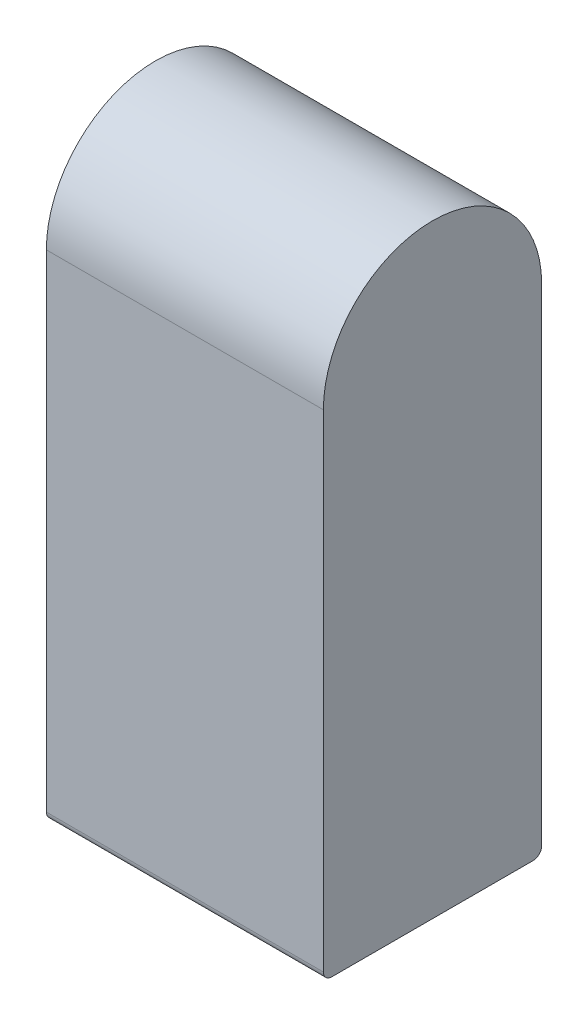
ISO-10303-21;
HEADER;
FILE_DESCRIPTION(('STEP AP214'),'2;1');
FILE_NAME('part.step','',(''),(''),'','','');
FILE_SCHEMA(('AUTOMOTIVE_DESIGN { 1 0 10303 214 1 1 1 1 }'));
ENDSEC;
DATA;
#1=APPLICATION_CONTEXT('core data for automotive mechanical design processes');
#2=APPLICATION_PROTOCOL_DEFINITION('international standard','automotive_design',2000,#1);
#3=PRODUCT_CONTEXT('',#1,'mechanical');
#4=PRODUCT('Part','Part','',(#3));
#5=PRODUCT_RELATED_PRODUCT_CATEGORY('part','',(#4));
#6=PRODUCT_DEFINITION_FORMATION('','',#4);
#7=PRODUCT_DEFINITION_CONTEXT('part definition',#1,'design');
#8=PRODUCT_DEFINITION('design','',#6,#7);
#9=PRODUCT_DEFINITION_SHAPE('','',#8);
#10=(LENGTH_UNIT() NAMED_UNIT(*) SI_UNIT(.MILLI.,.METRE.));
#11=(NAMED_UNIT(*) PLANE_ANGLE_UNIT() SI_UNIT($,.RADIAN.));
#12=(NAMED_UNIT(*) SI_UNIT($,.STERADIAN.) SOLID_ANGLE_UNIT());
#13=UNCERTAINTY_MEASURE_WITH_UNIT(LENGTH_MEASURE(1.E-05),#10,'distance_accuracy_value','');
#14=(GEOMETRIC_REPRESENTATION_CONTEXT(3) GLOBAL_UNCERTAINTY_ASSIGNED_CONTEXT((#13)) GLOBAL_UNIT_ASSIGNED_CONTEXT((#10,
#11,#12)) REPRESENTATION_CONTEXT('',''));
#15=CARTESIAN_POINT('',(0.,0.,0.));
#16=DIRECTION('',(0.,0.,1.));
#17=DIRECTION('',(1.,0.,0.));
#18=AXIS2_PLACEMENT_3D('',#15,#16,#17);
#19=CARTESIAN_POINT('',(16.5,29.,0.));
#20=DIRECTION('',(-1.,0.,0.));
#21=DIRECTION('',(0.,0.,1.));
#22=AXIS2_PLACEMENT_3D('',#19,#20,#21);
#23=CYLINDRICAL_SURFACE('',#22,13.);
#24=CARTESIAN_POINT('',(-16.5,29.,0.));
#25=DIRECTION('',(1.,0.,0.));
#26=DIRECTION('',(0.,0.,-1.));
#27=AXIS2_PLACEMENT_3D('',#24,#25,#26);
#28=CIRCLE('',#27,13.);
#29=CARTESIAN_POINT('',(-16.5,29.,-13.));
#30=VERTEX_POINT('',#29);
#31=CARTESIAN_POINT('',(-16.5,29.,13.));
#32=VERTEX_POINT('',#31);
#33=EDGE_CURVE('E123',#30,#32,#28,.T.);
#34=ORIENTED_EDGE('',*,*,#33,.T.);
#35=DIRECTION('',(-1.,0.,0.));
#36=VECTOR('',#35,1.);
#37=CARTESIAN_POINT('',(16.5,29.,13.));
#38=LINE('',#37,#36);
#39=CARTESIAN_POINT('',(16.5,29.,13.));
#40=VERTEX_POINT('',#39);
#41=EDGE_CURVE('E11',#40,#32,#38,.T.);
#42=ORIENTED_EDGE('',*,*,#41,.F.);
#43=CARTESIAN_POINT('',(16.5,29.,0.));
#44=DIRECTION('',(1.,0.,0.));
#45=DIRECTION('',(0.,0.,-1.));
#46=AXIS2_PLACEMENT_3D('',#43,#44,#45);
#47=CIRCLE('',#46,13.);
#48=CARTESIAN_POINT('',(16.5,29.,-13.));
#49=VERTEX_POINT('',#48);
#50=EDGE_CURVE('E133',#49,#40,#47,.T.);
#51=ORIENTED_EDGE('',*,*,#50,.F.);
#52=DIRECTION('',(-1.,0.,0.));
#53=VECTOR('',#52,1.);
#54=CARTESIAN_POINT('',(16.5,29.,-13.));
#55=LINE('',#54,#53);
#56=EDGE_CURVE('E119',#49,#30,#55,.T.);
#57=ORIENTED_EDGE('',*,*,#56,.T.);
#58=EDGE_LOOP('',(#34,#42,#51,#57));
#59=FACE_BOUND('',#58,.T.);
#60=ADVANCED_FACE('F39',(#59),#23,.T.);
#61=CARTESIAN_POINT('',(16.5,29.,13.));
#62=DIRECTION('',(0.,0.,-1.));
#63=DIRECTION('',(0.,1.,0.));
#64=AXIS2_PLACEMENT_3D('',#61,#62,#63);
#65=PLANE('',#64);
#66=DIRECTION('',(0.,-1.,0.));
#67=VECTOR('',#66,1.);
#68=CARTESIAN_POINT('',(-16.5,29.,13.));
#69=LINE('',#68,#67);
#70=CARTESIAN_POINT('',(-16.5,-29.,13.));
#71=VERTEX_POINT('',#70);
#72=EDGE_CURVE('E126',#32,#71,#69,.T.);
#73=ORIENTED_EDGE('',*,*,#72,.T.);
#74=DIRECTION('',(-1.,0.,0.));
#75=VECTOR('',#74,1.);
#76=CARTESIAN_POINT('',(16.5,-29.,13.));
#77=LINE('',#76,#75);
#78=CARTESIAN_POINT('',(16.5,-29.,13.));
#79=VERTEX_POINT('',#78);
#80=EDGE_CURVE('E47',#79,#71,#77,.T.);
#81=ORIENTED_EDGE('',*,*,#80,.F.);
#82=DIRECTION('',(0.,-1.,0.));
#83=VECTOR('',#82,1.);
#84=CARTESIAN_POINT('',(16.5,29.,13.));
#85=LINE('',#84,#83);
#86=EDGE_CURVE('E92',#40,#79,#85,.T.);
#87=ORIENTED_EDGE('',*,*,#86,.F.);
#88=ORIENTED_EDGE('',*,*,#41,.T.);
#89=EDGE_LOOP('',(#73,#81,#87,#88));
#90=FACE_BOUND('',#89,.T.);
#91=ADVANCED_FACE('F157',(#90),#65,.F.);
#92=CARTESIAN_POINT('',(16.5,-29.,12.));
#93=DIRECTION('',(-1.,0.,0.));
#94=DIRECTION('',(0.,0.,1.));
#95=AXIS2_PLACEMENT_3D('',#92,#93,#94);
#96=CYLINDRICAL_SURFACE('',#95,0.999999999999994);
#97=CARTESIAN_POINT('',(-16.5,-29.,12.));
#98=DIRECTION('',(1.,0.,0.));
#99=DIRECTION('',(0.,0.,1.));
#100=AXIS2_PLACEMENT_3D('',#97,#98,#99);
#101=CIRCLE('',#100,0.999999999999994);
#102=CARTESIAN_POINT('',(-16.5,-30.,12.));
#103=VERTEX_POINT('',#102);
#104=EDGE_CURVE('E128',#71,#103,#101,.T.);
#105=ORIENTED_EDGE('',*,*,#104,.T.);
#106=DIRECTION('',(-1.,0.,0.));
#107=VECTOR('',#106,1.);
#108=CARTESIAN_POINT('',(16.5,-30.,12.));
#109=LINE('',#108,#107);
#110=CARTESIAN_POINT('',(16.5,-30.,12.));
#111=VERTEX_POINT('',#110);
#112=EDGE_CURVE('E114',#111,#103,#109,.T.);
#113=ORIENTED_EDGE('',*,*,#112,.F.);
#114=CARTESIAN_POINT('',(16.5,-29.,12.));
#115=DIRECTION('',(1.,0.,0.));
#116=DIRECTION('',(0.,0.,1.));
#117=AXIS2_PLACEMENT_3D('',#114,#115,#116);
#118=CIRCLE('',#117,0.999999999999994);
#119=EDGE_CURVE('E105',#79,#111,#118,.T.);
#120=ORIENTED_EDGE('',*,*,#119,.F.);
#121=ORIENTED_EDGE('',*,*,#80,.T.);
#122=EDGE_LOOP('',(#105,#113,#120,#121));
#123=FACE_BOUND('',#122,.T.);
#124=ADVANCED_FACE('F139',(#123),#96,.T.);
#125=CARTESIAN_POINT('',(16.5,-30.,12.));
#126=DIRECTION('',(0.,1.,0.));
#127=DIRECTION('',(0.,0.,1.));
#128=AXIS2_PLACEMENT_3D('',#125,#126,#127);
#129=PLANE('',#128);
#130=DIRECTION('',(0.,0.,-1.));
#131=VECTOR('',#130,1.);
#132=CARTESIAN_POINT('',(-16.5,-30.,12.));
#133=LINE('',#132,#131);
#134=CARTESIAN_POINT('',(-16.5,-30.,-12.));
#135=VERTEX_POINT('',#134);
#136=EDGE_CURVE('E113',#103,#135,#133,.T.);
#137=ORIENTED_EDGE('',*,*,#136,.T.);
#138=DIRECTION('',(-1.,0.,0.));
#139=VECTOR('',#138,1.);
#140=CARTESIAN_POINT('',(16.5,-30.,-12.));
#141=LINE('',#140,#139);
#142=CARTESIAN_POINT('',(16.5,-30.,-12.));
#143=VERTEX_POINT('',#142);
#144=EDGE_CURVE('E110',#143,#135,#141,.T.);
#145=ORIENTED_EDGE('',*,*,#144,.F.);
#146=DIRECTION('',(0.,0.,-1.));
#147=VECTOR('',#146,1.);
#148=CARTESIAN_POINT('',(16.5,-30.,12.));
#149=LINE('',#148,#147);
#150=EDGE_CURVE('E99',#111,#143,#149,.T.);
#151=ORIENTED_EDGE('',*,*,#150,.F.);
#152=ORIENTED_EDGE('',*,*,#112,.T.);
#153=EDGE_LOOP('',(#137,#145,#151,#152));
#154=FACE_BOUND('',#153,.T.);
#155=ADVANCED_FACE('F111',(#154),#129,.F.);
#156=CARTESIAN_POINT('',(16.5,-29.,-12.));
#157=DIRECTION('',(-1.,0.,0.));
#158=DIRECTION('',(0.,0.,1.));
#159=AXIS2_PLACEMENT_3D('',#156,#157,#158);
#160=CYLINDRICAL_SURFACE('',#159,0.999999999999992);
#161=CARTESIAN_POINT('',(-16.5,-29.,-12.));
#162=DIRECTION('',(1.,0.,0.));
#163=DIRECTION('',(0.,0.,-1.));
#164=AXIS2_PLACEMENT_3D('',#161,#162,#163);
#165=CIRCLE('',#164,0.999999999999992);
#166=CARTESIAN_POINT('',(-16.5,-29.,-13.));
#167=VERTEX_POINT('',#166);
#168=EDGE_CURVE('E78',#135,#167,#165,.T.);
#169=ORIENTED_EDGE('',*,*,#168,.T.);
#170=DIRECTION('',(-1.,0.,0.));
#171=VECTOR('',#170,1.);
#172=CARTESIAN_POINT('',(16.5,-29.,-13.));
#173=LINE('',#172,#171);
#174=CARTESIAN_POINT('',(16.5,-29.,-13.));
#175=VERTEX_POINT('',#174);
#176=EDGE_CURVE('E115',#175,#167,#173,.T.);
#177=ORIENTED_EDGE('',*,*,#176,.F.);
#178=CARTESIAN_POINT('',(16.5,-29.,-12.));
#179=DIRECTION('',(1.,0.,0.));
#180=DIRECTION('',(0.,0.,-1.));
#181=AXIS2_PLACEMENT_3D('',#178,#179,#180);
#182=CIRCLE('',#181,0.999999999999992);
#183=EDGE_CURVE('E103',#143,#175,#182,.T.);
#184=ORIENTED_EDGE('',*,*,#183,.F.);
#185=ORIENTED_EDGE('',*,*,#144,.T.);
#186=EDGE_LOOP('',(#169,#177,#184,#185));
#187=FACE_BOUND('',#186,.T.);
#188=ADVANCED_FACE('F117',(#187),#160,.T.);
#189=CARTESIAN_POINT('',(16.5,-29.,-13.));
#190=DIRECTION('',(0.,0.,1.));
#191=DIRECTION('',(0.,-1.,0.));
#192=AXIS2_PLACEMENT_3D('',#189,#190,#191);
#193=PLANE('',#192);
#194=DIRECTION('',(0.,1.,0.));
#195=VECTOR('',#194,1.);
#196=CARTESIAN_POINT('',(-16.5,-29.,-13.));
#197=LINE('',#196,#195);
#198=EDGE_CURVE('E84',#167,#30,#197,.T.);
#199=ORIENTED_EDGE('',*,*,#198,.T.);
#200=ORIENTED_EDGE('',*,*,#56,.F.);
#201=DIRECTION('',(0.,1.,0.));
#202=VECTOR('',#201,1.);
#203=CARTESIAN_POINT('',(16.5,-29.,-13.));
#204=LINE('',#203,#202);
#205=EDGE_CURVE('E55',#175,#49,#204,.T.);
#206=ORIENTED_EDGE('',*,*,#205,.F.);
#207=ORIENTED_EDGE('',*,*,#176,.T.);
#208=EDGE_LOOP('',(#199,#200,#206,#207));
#209=FACE_BOUND('',#208,.T.);
#210=ADVANCED_FACE('F146',(#209),#193,.F.);
#211=CARTESIAN_POINT('',(16.5,29.,0.));
#212=DIRECTION('',(1.,0.,0.));
#213=DIRECTION('',(0.,0.,-1.));
#214=AXIS2_PLACEMENT_3D('',#211,#212,#213);
#215=PLANE('',#214);
#216=ORIENTED_EDGE('',*,*,#50,.T.);
#217=ORIENTED_EDGE('',*,*,#86,.T.);
#218=ORIENTED_EDGE('',*,*,#119,.T.);
#219=ORIENTED_EDGE('',*,*,#150,.T.);
#220=ORIENTED_EDGE('',*,*,#183,.T.);
#221=ORIENTED_EDGE('',*,*,#205,.T.);
#222=EDGE_LOOP('',(#216,#217,#218,#219,#220,#221));
#223=FACE_BOUND('',#222,.T.);
#224=ADVANCED_FACE('F101',(#223),#215,.T.);
#225=CARTESIAN_POINT('',(-16.5,29.,0.));
#226=DIRECTION('',(1.,0.,0.));
#227=DIRECTION('',(0.,0.,-1.));
#228=AXIS2_PLACEMENT_3D('',#225,#226,#227);
#229=PLANE('',#228);
#230=ORIENTED_EDGE('',*,*,#33,.F.);
#231=ORIENTED_EDGE('',*,*,#198,.F.);
#232=ORIENTED_EDGE('',*,*,#168,.F.);
#233=ORIENTED_EDGE('',*,*,#136,.F.);
#234=ORIENTED_EDGE('',*,*,#104,.F.);
#235=ORIENTED_EDGE('',*,*,#72,.F.);
#236=EDGE_LOOP('',(#230,#231,#232,#233,#234,#235));
#237=FACE_BOUND('',#236,.T.);
#238=ADVANCED_FACE('F142',(#237),#229,.F.);
#239=CLOSED_SHELL('',(#60,#91,#124,#155,#188,#210,#224,#238));
#240=MANIFOLD_SOLID_BREP('B2',#239);
#241=ADVANCED_BREP_SHAPE_REPRESENTATION('',(#18,#240),#14);
#242=SHAPE_DEFINITION_REPRESENTATION(#9,#241);
ENDSEC;
END-ISO-10303-21;
